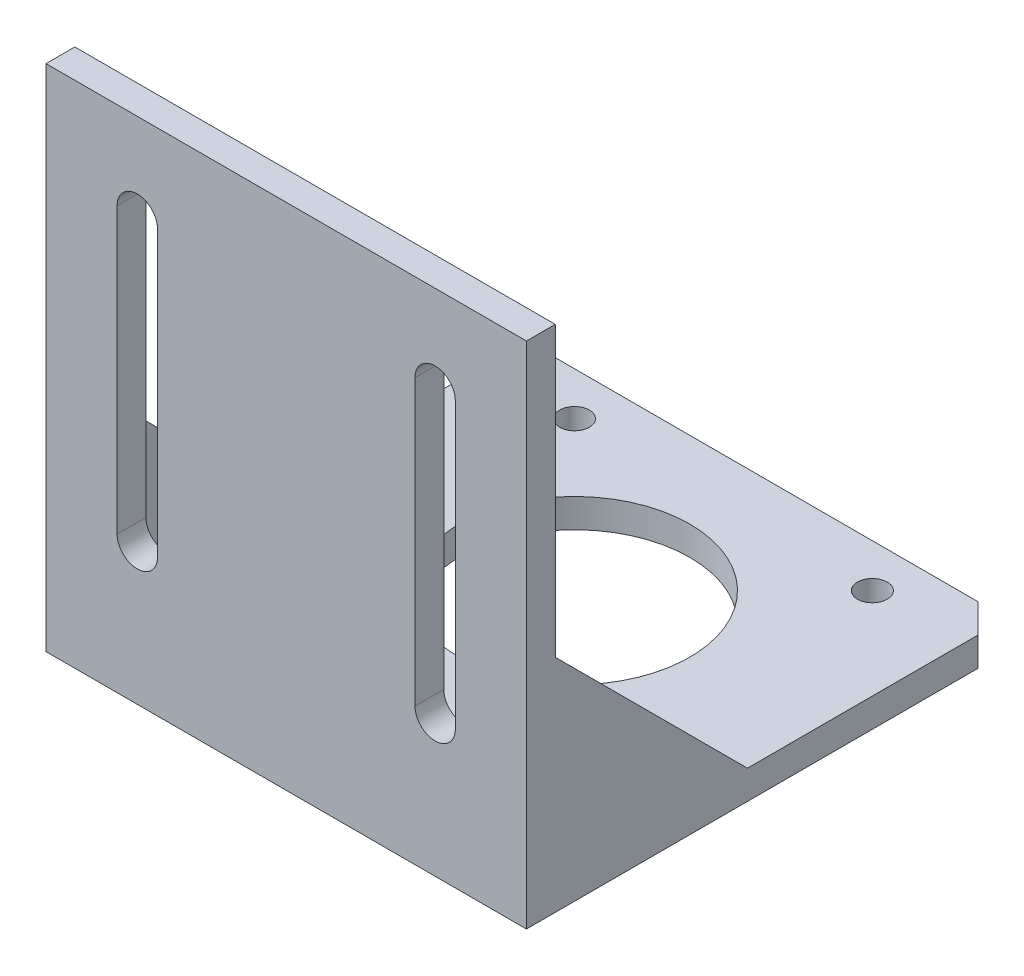
ISO-10303-21;
HEADER;
FILE_DESCRIPTION(('STEP AP214'),'2;1');
FILE_NAME('part.step','',(''),(''),'','','');
FILE_SCHEMA(('AUTOMOTIVE_DESIGN { 1 0 10303 214 1 1 1 1 }'));
ENDSEC;
DATA;
#1=APPLICATION_CONTEXT('core data for automotive mechanical design processes');
#2=APPLICATION_PROTOCOL_DEFINITION('international standard','automotive_design',2000,#1);
#3=PRODUCT_CONTEXT('',#1,'mechanical');
#4=PRODUCT('Part','Part','',(#3));
#5=PRODUCT_RELATED_PRODUCT_CATEGORY('part','',(#4));
#6=PRODUCT_DEFINITION_FORMATION('','',#4);
#7=PRODUCT_DEFINITION_CONTEXT('part definition',#1,'design');
#8=PRODUCT_DEFINITION('design','',#6,#7);
#9=PRODUCT_DEFINITION_SHAPE('','',#8);
#10=(LENGTH_UNIT() NAMED_UNIT(*) SI_UNIT(.MILLI.,.METRE.));
#11=(NAMED_UNIT(*) PLANE_ANGLE_UNIT() SI_UNIT($,.RADIAN.));
#12=(NAMED_UNIT(*) SI_UNIT($,.STERADIAN.) SOLID_ANGLE_UNIT());
#13=UNCERTAINTY_MEASURE_WITH_UNIT(LENGTH_MEASURE(1.E-05),#10,'distance_accuracy_value','');
#14=(GEOMETRIC_REPRESENTATION_CONTEXT(3) GLOBAL_UNCERTAINTY_ASSIGNED_CONTEXT((#13)) GLOBAL_UNIT_ASSIGNED_CONTEXT((#10,
#11,#12)) REPRESENTATION_CONTEXT('',''));
#15=CARTESIAN_POINT('',(0.,0.,0.));
#16=DIRECTION('',(0.,0.,1.));
#17=DIRECTION('',(1.,0.,0.));
#18=AXIS2_PLACEMENT_3D('',#15,#16,#17);
#19=CARTESIAN_POINT('',(0.,3.,0.));
#20=DIRECTION('',(0.,1.,0.));
#21=DIRECTION('',(0.,0.,1.));
#22=AXIS2_PLACEMENT_3D('',#19,#20,#21);
#23=PLANE('',#22);
#24=CARTESIAN_POINT('',(40.5,3.,-14.5));
#25=DIRECTION('',(0.,1.,0.));
#26=DIRECTION('',(0.,0.,1.));
#27=AXIS2_PLACEMENT_3D('',#24,#25,#26);
#28=CIRCLE('',#27,1.55);
#29=CARTESIAN_POINT('',(40.5,3.,-12.95));
#30=VERTEX_POINT('',#29);
#31=EDGE_CURVE('E301',#30,#30,#28,.T.);
#32=ORIENTED_EDGE('',*,*,#31,.F.);
#33=EDGE_LOOP('',(#32));
#34=FACE_BOUND('',#33,.T.);
#35=CARTESIAN_POINT('',(9.50000000000001,3.,-45.5));
#36=DIRECTION('',(0.,1.,0.));
#37=DIRECTION('',(0.,0.,1.));
#38=AXIS2_PLACEMENT_3D('',#35,#36,#37);
#39=CIRCLE('',#38,1.55);
#40=CARTESIAN_POINT('',(9.50000000000001,3.,-43.95));
#41=VERTEX_POINT('',#40);
#42=EDGE_CURVE('E313',#41,#41,#39,.T.);
#43=ORIENTED_EDGE('',*,*,#42,.F.);
#44=EDGE_LOOP('',(#43));
#45=FACE_BOUND('',#44,.T.);
#46=CARTESIAN_POINT('',(25.,3.,-30.));
#47=DIRECTION('',(0.,1.,0.));
#48=DIRECTION('',(0.,0.,1.));
#49=AXIS2_PLACEMENT_3D('',#46,#47,#48);
#50=CIRCLE('',#49,12.);
#51=CARTESIAN_POINT('',(25.,3.,-18.));
#52=VERTEX_POINT('',#51);
#53=EDGE_CURVE('E319',#52,#52,#50,.T.);
#54=ORIENTED_EDGE('',*,*,#53,.F.);
#55=EDGE_LOOP('',(#54));
#56=FACE_BOUND('',#55,.T.);
#57=CARTESIAN_POINT('',(40.5,3.,-45.5));
#58=DIRECTION('',(0.,1.,0.));
#59=DIRECTION('',(0.,0.,1.));
#60=AXIS2_PLACEMENT_3D('',#57,#58,#59);
#61=CIRCLE('',#60,1.54999999999999);
#62=CARTESIAN_POINT('',(40.5,3.,-43.95));
#63=VERTEX_POINT('',#62);
#64=EDGE_CURVE('E307',#63,#63,#61,.T.);
#65=ORIENTED_EDGE('',*,*,#64,.F.);
#66=EDGE_LOOP('',(#65));
#67=FACE_BOUND('',#66,.T.);
#68=CARTESIAN_POINT('',(9.50000000000001,3.,-14.5));
#69=DIRECTION('',(0.,1.,0.));
#70=DIRECTION('',(0.,0.,1.));
#71=AXIS2_PLACEMENT_3D('',#68,#69,#70);
#72=CIRCLE('',#71,1.55);
#73=CARTESIAN_POINT('',(9.50000000000001,3.,-12.95));
#74=VERTEX_POINT('',#73);
#75=EDGE_CURVE('E295',#74,#74,#72,.T.);
#76=ORIENTED_EDGE('',*,*,#75,.F.);
#77=EDGE_LOOP('',(#76));
#78=FACE_BOUND('',#77,.T.);
#79=DIRECTION('',(-1.,0.,0.));
#80=VECTOR('',#79,1.);
#81=CARTESIAN_POINT('',(0.,3.,-23.));
#82=LINE('',#81,#80);
#83=CARTESIAN_POINT('',(3.00000000000001,3.,-23.));
#84=VERTEX_POINT('',#83);
#85=CARTESIAN_POINT('',(0.,3.,-23.));
#86=VERTEX_POINT('',#85);
#87=EDGE_CURVE('E57',#84,#86,#82,.T.);
#88=ORIENTED_EDGE('',*,*,#87,.F.);
#89=DIRECTION('',(0.,0.,-1.));
#90=VECTOR('',#89,1.);
#91=CARTESIAN_POINT('',(3.00000000000001,3.,-3.));
#92=LINE('',#91,#90);
#93=CARTESIAN_POINT('',(3.00000000000001,3.,-3.));
#94=VERTEX_POINT('',#93);
#95=EDGE_CURVE('E216',#94,#84,#92,.T.);
#96=ORIENTED_EDGE('',*,*,#95,.F.);
#97=DIRECTION('',(-1.,0.,0.));
#98=VECTOR('',#97,1.);
#99=CARTESIAN_POINT('',(0.,3.,-3.));
#100=LINE('',#99,#98);
#101=CARTESIAN_POINT('',(47.,3.,-3.));
#102=VERTEX_POINT('',#101);
#103=EDGE_CURVE('E245',#102,#94,#100,.T.);
#104=ORIENTED_EDGE('',*,*,#103,.F.);
#105=DIRECTION('',(0.,0.,1.));
#106=VECTOR('',#105,1.);
#107=CARTESIAN_POINT('',(47.,3.,-3.));
#108=LINE('',#107,#106);
#109=CARTESIAN_POINT('',(47.,3.,-23.));
#110=VERTEX_POINT('',#109);
#111=EDGE_CURVE('E206',#110,#102,#108,.T.);
#112=ORIENTED_EDGE('',*,*,#111,.F.);
#113=DIRECTION('',(-1.,0.,0.));
#114=VECTOR('',#113,1.);
#115=CARTESIAN_POINT('',(50.,3.,-23.));
#116=LINE('',#115,#114);
#117=CARTESIAN_POINT('',(50.,3.,-23.));
#118=VERTEX_POINT('',#117);
#119=EDGE_CURVE('E210',#118,#110,#116,.T.);
#120=ORIENTED_EDGE('',*,*,#119,.F.);
#121=DIRECTION('',(0.,0.,-1.));
#122=VECTOR('',#121,1.);
#123=CARTESIAN_POINT('',(50.,3.,0.));
#124=LINE('',#123,#122);
#125=CARTESIAN_POINT('',(50.,3.,-46.9947961799572));
#126=VERTEX_POINT('',#125);
#127=EDGE_CURVE('E187',#118,#126,#124,.T.);
#128=ORIENTED_EDGE('',*,*,#127,.T.);
#129=DIRECTION('',(-0.707106781186547,0.,-0.707106781186548));
#130=VECTOR('',#129,1.);
#131=CARTESIAN_POINT('',(50.,3.,-46.9947961799572));
#132=LINE('',#131,#130);
#133=CARTESIAN_POINT('',(46.9947961799572,3.,-50.));
#134=VERTEX_POINT('',#133);
#135=EDGE_CURVE('E329',#126,#134,#132,.T.);
#136=ORIENTED_EDGE('',*,*,#135,.T.);
#137=DIRECTION('',(-1.,0.,0.));
#138=VECTOR('',#137,1.);
#139=CARTESIAN_POINT('',(46.9947961799572,3.,-50.));
#140=LINE('',#139,#138);
#141=CARTESIAN_POINT('',(3.00520382004284,3.,-50.));
#142=VERTEX_POINT('',#141);
#143=EDGE_CURVE('E331',#134,#142,#140,.T.);
#144=ORIENTED_EDGE('',*,*,#143,.T.);
#145=DIRECTION('',(-0.707106781186548,0.,0.707106781186547));
#146=VECTOR('',#145,1.);
#147=CARTESIAN_POINT('',(3.00520382004284,3.,-50.));
#148=LINE('',#147,#146);
#149=CARTESIAN_POINT('',(0.,3.,-46.9947961799572));
#150=VERTEX_POINT('',#149);
#151=EDGE_CURVE('E333',#142,#150,#148,.T.);
#152=ORIENTED_EDGE('',*,*,#151,.T.);
#153=DIRECTION('',(0.,0.,1.));
#154=VECTOR('',#153,1.);
#155=CARTESIAN_POINT('',(0.,3.,-46.9947961799572));
#156=LINE('',#155,#154);
#157=EDGE_CURVE('E325',#150,#86,#156,.T.);
#158=ORIENTED_EDGE('',*,*,#157,.T.);
#159=EDGE_LOOP('',(#88,#96,#104,#112,#120,#128,#136,#144,#152,#158));
#160=FACE_BOUND('',#159,.T.);
#161=ADVANCED_FACE('F41',(#34,#45,#56,#67,#78,#160),#23,.T.);
#162=CARTESIAN_POINT('',(0.,53.,-3.));
#163=DIRECTION('',(0.,0.,1.));
#164=DIRECTION('',(1.,0.,0.));
#165=AXIS2_PLACEMENT_3D('',#162,#163,#164);
#166=PLANE('',#165);
#167=DIRECTION('',(0.,1.,0.));
#168=VECTOR('',#167,1.);
#169=CARTESIAN_POINT('',(38.4,14.3,-3.));
#170=LINE('',#169,#168);
#171=CARTESIAN_POINT('',(38.4,14.3,-3.));
#172=VERTEX_POINT('',#171);
#173=CARTESIAN_POINT('',(38.4,43.9,-3.));
#174=VERTEX_POINT('',#173);
#175=EDGE_CURVE('E234',#172,#174,#170,.T.);
#176=ORIENTED_EDGE('',*,*,#175,.F.);
#177=CARTESIAN_POINT('',(40.5,14.3,-3.));
#178=DIRECTION('',(0.,0.,-1.));
#179=DIRECTION('',(-1.,0.,0.));
#180=AXIS2_PLACEMENT_3D('',#177,#178,#179);
#181=CIRCLE('',#180,2.1);
#182=CARTESIAN_POINT('',(42.6,14.3,-3.));
#183=VERTEX_POINT('',#182);
#184=EDGE_CURVE('E232',#183,#172,#181,.T.);
#185=ORIENTED_EDGE('',*,*,#184,.F.);
#186=DIRECTION('',(0.,-1.,0.));
#187=VECTOR('',#186,1.);
#188=CARTESIAN_POINT('',(42.6,14.3,-3.));
#189=LINE('',#188,#187);
#190=CARTESIAN_POINT('',(42.6,43.9,-3.));
#191=VERTEX_POINT('',#190);
#192=EDGE_CURVE('E222',#191,#183,#189,.T.);
#193=ORIENTED_EDGE('',*,*,#192,.F.);
#194=CARTESIAN_POINT('',(40.5,43.9,-3.));
#195=DIRECTION('',(0.,0.,-1.));
#196=DIRECTION('',(-1.,0.,0.));
#197=AXIS2_PLACEMENT_3D('',#194,#195,#196);
#198=CIRCLE('',#197,2.1);
#199=EDGE_CURVE('E238',#174,#191,#198,.T.);
#200=ORIENTED_EDGE('',*,*,#199,.F.);
#201=EDGE_LOOP('',(#176,#185,#193,#200));
#202=FACE_BOUND('',#201,.T.);
#203=DIRECTION('',(0.,1.,0.));
#204=VECTOR('',#203,1.);
#205=CARTESIAN_POINT('',(7.40000000000001,14.3,-3.));
#206=LINE('',#205,#204);
#207=CARTESIAN_POINT('',(7.40000000000001,14.3,-3.));
#208=VERTEX_POINT('',#207);
#209=CARTESIAN_POINT('',(7.40000000000001,43.9,-3.));
#210=VERTEX_POINT('',#209);
#211=EDGE_CURVE('E268',#208,#210,#206,.T.);
#212=ORIENTED_EDGE('',*,*,#211,.F.);
#213=CARTESIAN_POINT('',(9.50000000000001,14.3,-3.));
#214=DIRECTION('',(0.,0.,-1.));
#215=DIRECTION('',(-1.,0.,0.));
#216=AXIS2_PLACEMENT_3D('',#213,#214,#215);
#217=CIRCLE('',#216,2.1);
#218=CARTESIAN_POINT('',(11.6,14.3,-3.));
#219=VERTEX_POINT('',#218);
#220=EDGE_CURVE('E235',#219,#208,#217,.T.);
#221=ORIENTED_EDGE('',*,*,#220,.F.);
#222=DIRECTION('',(0.,-1.,0.));
#223=VECTOR('',#222,1.);
#224=CARTESIAN_POINT('',(11.6,14.3,-3.));
#225=LINE('',#224,#223);
#226=CARTESIAN_POINT('',(11.6,43.9,-3.));
#227=VERTEX_POINT('',#226);
#228=EDGE_CURVE('E261',#227,#219,#225,.T.);
#229=ORIENTED_EDGE('',*,*,#228,.F.);
#230=CARTESIAN_POINT('',(9.50000000000001,43.9,-3.));
#231=DIRECTION('',(0.,0.,-1.));
#232=DIRECTION('',(-1.,0.,0.));
#233=AXIS2_PLACEMENT_3D('',#230,#231,#232);
#234=CIRCLE('',#233,2.1);
#235=EDGE_CURVE('E264',#210,#227,#234,.T.);
#236=ORIENTED_EDGE('',*,*,#235,.F.);
#237=EDGE_LOOP('',(#212,#221,#229,#236));
#238=FACE_BOUND('',#237,.T.);
#239=DIRECTION('',(0.,-1.,0.));
#240=VECTOR('',#239,1.);
#241=CARTESIAN_POINT('',(3.00000000000001,23.,-3.));
#242=LINE('',#241,#240);
#243=CARTESIAN_POINT('',(3.00000000000001,23.,-3.));
#244=VERTEX_POINT('',#243);
#245=EDGE_CURVE('E374',#244,#94,#242,.T.);
#246=ORIENTED_EDGE('',*,*,#245,.F.);
#247=DIRECTION('',(1.,0.,0.));
#248=VECTOR('',#247,1.);
#249=CARTESIAN_POINT('',(0.,23.,-3.));
#250=LINE('',#249,#248);
#251=CARTESIAN_POINT('',(0.,23.,-3.));
#252=VERTEX_POINT('',#251);
#253=EDGE_CURVE('E214',#252,#244,#250,.T.);
#254=ORIENTED_EDGE('',*,*,#253,.F.);
#255=DIRECTION('',(0.,-1.,0.));
#256=VECTOR('',#255,1.);
#257=CARTESIAN_POINT('',(0.,53.,-3.));
#258=LINE('',#257,#256);
#259=CARTESIAN_POINT('',(0.,53.,-3.));
#260=VERTEX_POINT('',#259);
#261=EDGE_CURVE('E201',#260,#252,#258,.T.);
#262=ORIENTED_EDGE('',*,*,#261,.F.);
#263=DIRECTION('',(-1.,0.,0.));
#264=VECTOR('',#263,1.);
#265=CARTESIAN_POINT('',(0.,53.,-3.));
#266=LINE('',#265,#264);
#267=CARTESIAN_POINT('',(50.,53.,-3.));
#268=VERTEX_POINT('',#267);
#269=EDGE_CURVE('E199',#268,#260,#266,.T.);
#270=ORIENTED_EDGE('',*,*,#269,.F.);
#271=DIRECTION('',(0.,-1.,0.));
#272=VECTOR('',#271,1.);
#273=CARTESIAN_POINT('',(50.,53.,-3.));
#274=LINE('',#273,#272);
#275=CARTESIAN_POINT('',(50.,23.,-3.));
#276=VERTEX_POINT('',#275);
#277=EDGE_CURVE('E184',#268,#276,#274,.T.);
#278=ORIENTED_EDGE('',*,*,#277,.T.);
#279=DIRECTION('',(1.,0.,0.));
#280=VECTOR('',#279,1.);
#281=CARTESIAN_POINT('',(50.,23.,-3.));
#282=LINE('',#281,#280);
#283=CARTESIAN_POINT('',(47.,23.,-3.));
#284=VERTEX_POINT('',#283);
#285=EDGE_CURVE('E197',#284,#276,#282,.T.);
#286=ORIENTED_EDGE('',*,*,#285,.F.);
#287=DIRECTION('',(0.,-1.,0.));
#288=VECTOR('',#287,1.);
#289=CARTESIAN_POINT('',(47.,23.,-3.));
#290=LINE('',#289,#288);
#291=EDGE_CURVE('E205',#284,#102,#290,.T.);
#292=ORIENTED_EDGE('',*,*,#291,.T.);
#293=ORIENTED_EDGE('',*,*,#103,.T.);
#294=EDGE_LOOP('',(#246,#254,#262,#270,#278,#286,#292,#293));
#295=FACE_BOUND('',#294,.T.);
#296=ADVANCED_FACE('F195',(#202,#238,#295),#166,.F.);
#297=CARTESIAN_POINT('',(0.,0.,0.));
#298=DIRECTION('',(0.,1.,0.));
#299=DIRECTION('',(0.,0.,1.));
#300=AXIS2_PLACEMENT_3D('',#297,#298,#299);
#301=PLANE('',#300);
#302=DIRECTION('',(0.,0.,1.));
#303=VECTOR('',#302,1.);
#304=CARTESIAN_POINT('',(0.,0.,-46.9947961799572));
#305=LINE('',#304,#303);
#306=CARTESIAN_POINT('',(0.,0.,-46.9947961799572));
#307=VERTEX_POINT('',#306);
#308=CARTESIAN_POINT('',(0.,0.,0.));
#309=VERTEX_POINT('',#308);
#310=EDGE_CURVE('E322',#307,#309,#305,.T.);
#311=ORIENTED_EDGE('',*,*,#310,.F.);
#312=DIRECTION('',(-0.707106781186548,0.,0.707106781186547));
#313=VECTOR('',#312,1.);
#314=CARTESIAN_POINT('',(3.00520382004284,0.,-50.));
#315=LINE('',#314,#313);
#316=CARTESIAN_POINT('',(3.00520382004284,0.,-50.));
#317=VERTEX_POINT('',#316);
#318=EDGE_CURVE('E327',#317,#307,#315,.T.);
#319=ORIENTED_EDGE('',*,*,#318,.F.);
#320=DIRECTION('',(-1.,0.,0.));
#321=VECTOR('',#320,1.);
#322=CARTESIAN_POINT('',(46.9947961799572,0.,-50.));
#323=LINE('',#322,#321);
#324=CARTESIAN_POINT('',(46.9947961799572,0.,-50.));
#325=VERTEX_POINT('',#324);
#326=EDGE_CURVE('E344',#325,#317,#323,.T.);
#327=ORIENTED_EDGE('',*,*,#326,.F.);
#328=DIRECTION('',(-0.707106781186547,0.,-0.707106781186548));
#329=VECTOR('',#328,1.);
#330=CARTESIAN_POINT('',(50.,0.,-46.9947961799572));
#331=LINE('',#330,#329);
#332=CARTESIAN_POINT('',(50.,0.,-46.9947961799572));
#333=VERTEX_POINT('',#332);
#334=EDGE_CURVE('E342',#333,#325,#331,.T.);
#335=ORIENTED_EDGE('',*,*,#334,.F.);
#336=DIRECTION('',(0.,0.,-1.));
#337=VECTOR('',#336,1.);
#338=CARTESIAN_POINT('',(50.,0.,0.));
#339=LINE('',#338,#337);
#340=CARTESIAN_POINT('',(50.,0.,0.));
#341=VERTEX_POINT('',#340);
#342=EDGE_CURVE('E340',#341,#333,#339,.T.);
#343=ORIENTED_EDGE('',*,*,#342,.F.);
#344=DIRECTION('',(1.,0.,0.));
#345=VECTOR('',#344,1.);
#346=CARTESIAN_POINT('',(0.,0.,0.));
#347=LINE('',#346,#345);
#348=EDGE_CURVE('E338',#309,#341,#347,.T.);
#349=ORIENTED_EDGE('',*,*,#348,.F.);
#350=EDGE_LOOP('',(#311,#319,#327,#335,#343,#349));
#351=FACE_BOUND('',#350,.T.);
#352=CARTESIAN_POINT('',(25.,0.,-30.));
#353=DIRECTION('',(0.,1.,0.));
#354=DIRECTION('',(0.,0.,1.));
#355=AXIS2_PLACEMENT_3D('',#352,#353,#354);
#356=CIRCLE('',#355,12.);
#357=CARTESIAN_POINT('',(25.,0.,-18.));
#358=VERTEX_POINT('',#357);
#359=EDGE_CURVE('E316',#358,#358,#356,.T.);
#360=ORIENTED_EDGE('',*,*,#359,.T.);
#361=EDGE_LOOP('',(#360));
#362=FACE_BOUND('',#361,.T.);
#363=CARTESIAN_POINT('',(9.50000000000001,0.,-45.5));
#364=DIRECTION('',(0.,1.,0.));
#365=DIRECTION('',(0.,0.,1.));
#366=AXIS2_PLACEMENT_3D('',#363,#364,#365);
#367=CIRCLE('',#366,1.55);
#368=CARTESIAN_POINT('',(9.50000000000001,0.,-43.95));
#369=VERTEX_POINT('',#368);
#370=EDGE_CURVE('E310',#369,#369,#367,.T.);
#371=ORIENTED_EDGE('',*,*,#370,.T.);
#372=EDGE_LOOP('',(#371));
#373=FACE_BOUND('',#372,.T.);
#374=CARTESIAN_POINT('',(40.5,0.,-45.5));
#375=DIRECTION('',(0.,1.,0.));
#376=DIRECTION('',(0.,0.,1.));
#377=AXIS2_PLACEMENT_3D('',#374,#375,#376);
#378=CIRCLE('',#377,1.54999999999999);
#379=CARTESIAN_POINT('',(40.5,0.,-43.95));
#380=VERTEX_POINT('',#379);
#381=EDGE_CURVE('E304',#380,#380,#378,.T.);
#382=ORIENTED_EDGE('',*,*,#381,.T.);
#383=EDGE_LOOP('',(#382));
#384=FACE_BOUND('',#383,.T.);
#385=CARTESIAN_POINT('',(40.5,0.,-14.5));
#386=DIRECTION('',(0.,1.,0.));
#387=DIRECTION('',(0.,0.,1.));
#388=AXIS2_PLACEMENT_3D('',#385,#386,#387);
#389=CIRCLE('',#388,1.55);
#390=CARTESIAN_POINT('',(40.5,0.,-12.95));
#391=VERTEX_POINT('',#390);
#392=EDGE_CURVE('E298',#391,#391,#389,.T.);
#393=ORIENTED_EDGE('',*,*,#392,.T.);
#394=EDGE_LOOP('',(#393));
#395=FACE_BOUND('',#394,.T.);
#396=CARTESIAN_POINT('',(9.50000000000001,0.,-14.5));
#397=DIRECTION('',(0.,1.,0.));
#398=DIRECTION('',(0.,0.,1.));
#399=AXIS2_PLACEMENT_3D('',#396,#397,#398);
#400=CIRCLE('',#399,1.55);
#401=CARTESIAN_POINT('',(9.50000000000001,0.,-12.95));
#402=VERTEX_POINT('',#401);
#403=EDGE_CURVE('E200',#402,#402,#400,.T.);
#404=ORIENTED_EDGE('',*,*,#403,.T.);
#405=EDGE_LOOP('',(#404));
#406=FACE_BOUND('',#405,.T.);
#407=ADVANCED_FACE('F400',(#351,#362,#373,#384,#395,#406),#301,.F.);
#408=CARTESIAN_POINT('',(0.,3.,-46.9947961799572));
#409=DIRECTION('',(1.,0.,0.));
#410=DIRECTION('',(0.,0.,-1.));
#411=AXIS2_PLACEMENT_3D('',#408,#409,#410);
#412=PLANE('',#411);
#413=ORIENTED_EDGE('',*,*,#261,.T.);
#414=DIRECTION('',(0.,0.707106781186549,0.707106781186546));
#415=VECTOR('',#414,1.);
#416=CARTESIAN_POINT('',(0.,23.,-3.00000000000001));
#417=LINE('',#416,#415);
#418=EDGE_CURVE('E50',#252,#86,#417,.F.);
#419=ORIENTED_EDGE('',*,*,#418,.T.);
#420=ORIENTED_EDGE('',*,*,#157,.F.);
#421=DIRECTION('',(0.,-1.,0.));
#422=VECTOR('',#421,1.);
#423=CARTESIAN_POINT('',(0.,3.,-46.9947961799572));
#424=LINE('',#423,#422);
#425=EDGE_CURVE('E335',#150,#307,#424,.T.);
#426=ORIENTED_EDGE('',*,*,#425,.T.);
#427=ORIENTED_EDGE('',*,*,#310,.T.);
#428=DIRECTION('',(0.,-1.,0.));
#429=VECTOR('',#428,1.);
#430=CARTESIAN_POINT('',(0.,3.,0.));
#431=LINE('',#430,#429);
#432=CARTESIAN_POINT('',(0.,53.,0.));
#433=VERTEX_POINT('',#432);
#434=EDGE_CURVE('E361',#433,#309,#431,.T.);
#435=ORIENTED_EDGE('',*,*,#434,.F.);
#436=DIRECTION('',(0.,0.,1.));
#437=VECTOR('',#436,1.);
#438=CARTESIAN_POINT('',(0.,53.,0.));
#439=LINE('',#438,#437);
#440=EDGE_CURVE('E282',#260,#433,#439,.T.);
#441=ORIENTED_EDGE('',*,*,#440,.F.);
#442=EDGE_LOOP('',(#413,#419,#420,#426,#427,#435,#441));
#443=FACE_BOUND('',#442,.T.);
#444=ADVANCED_FACE('F366',(#443),#412,.F.);
#445=CARTESIAN_POINT('',(0.,3.,0.));
#446=DIRECTION('',(0.,0.,-1.));
#447=DIRECTION('',(-1.,0.,0.));
#448=AXIS2_PLACEMENT_3D('',#445,#446,#447);
#449=PLANE('',#448);
#450=DIRECTION('',(0.,-1.,0.));
#451=VECTOR('',#450,1.);
#452=CARTESIAN_POINT('',(42.6,14.3,0.));
#453=LINE('',#452,#451);
#454=CARTESIAN_POINT('',(42.6,43.9,0.));
#455=VERTEX_POINT('',#454);
#456=CARTESIAN_POINT('',(42.6,14.3,0.));
#457=VERTEX_POINT('',#456);
#458=EDGE_CURVE('E228',#455,#457,#453,.T.);
#459=ORIENTED_EDGE('',*,*,#458,.T.);
#460=CARTESIAN_POINT('',(40.5,14.3,0.));
#461=DIRECTION('',(0.,0.,-1.));
#462=DIRECTION('',(-1.,0.,0.));
#463=AXIS2_PLACEMENT_3D('',#460,#461,#462);
#464=CIRCLE('',#463,2.1);
#465=CARTESIAN_POINT('',(38.4,14.3,0.));
#466=VERTEX_POINT('',#465);
#467=EDGE_CURVE('E218',#457,#466,#464,.T.);
#468=ORIENTED_EDGE('',*,*,#467,.T.);
#469=DIRECTION('',(0.,1.,0.));
#470=VECTOR('',#469,1.);
#471=CARTESIAN_POINT('',(38.4,14.3,0.));
#472=LINE('',#471,#470);
#473=CARTESIAN_POINT('',(38.4,43.9,0.));
#474=VERTEX_POINT('',#473);
#475=EDGE_CURVE('E221',#466,#474,#472,.T.);
#476=ORIENTED_EDGE('',*,*,#475,.T.);
#477=CARTESIAN_POINT('',(40.5,43.9,0.));
#478=DIRECTION('',(0.,0.,-1.));
#479=DIRECTION('',(-1.,0.,0.));
#480=AXIS2_PLACEMENT_3D('',#477,#478,#479);
#481=CIRCLE('',#480,2.1);
#482=EDGE_CURVE('E225',#474,#455,#481,.T.);
#483=ORIENTED_EDGE('',*,*,#482,.T.);
#484=EDGE_LOOP('',(#459,#468,#476,#483));
#485=FACE_BOUND('',#484,.T.);
#486=DIRECTION('',(0.,-1.,0.));
#487=VECTOR('',#486,1.);
#488=CARTESIAN_POINT('',(11.6,14.3,0.));
#489=LINE('',#488,#487);
#490=CARTESIAN_POINT('',(11.6,43.9,0.));
#491=VERTEX_POINT('',#490);
#492=CARTESIAN_POINT('',(11.6,14.3,0.));
#493=VERTEX_POINT('',#492);
#494=EDGE_CURVE('E255',#491,#493,#489,.T.);
#495=ORIENTED_EDGE('',*,*,#494,.T.);
#496=CARTESIAN_POINT('',(9.50000000000001,14.3,0.));
#497=DIRECTION('',(0.,0.,-1.));
#498=DIRECTION('',(-1.,0.,0.));
#499=AXIS2_PLACEMENT_3D('',#496,#497,#498);
#500=CIRCLE('',#499,2.1);
#501=CARTESIAN_POINT('',(7.40000000000001,14.3,0.));
#502=VERTEX_POINT('',#501);
#503=EDGE_CURVE('E265',#493,#502,#500,.T.);
#504=ORIENTED_EDGE('',*,*,#503,.T.);
#505=DIRECTION('',(0.,1.,0.));
#506=VECTOR('',#505,1.);
#507=CARTESIAN_POINT('',(7.40000000000001,14.3,0.));
#508=LINE('',#507,#506);
#509=CARTESIAN_POINT('',(7.40000000000001,43.9,0.));
#510=VERTEX_POINT('',#509);
#511=EDGE_CURVE('E277',#502,#510,#508,.T.);
#512=ORIENTED_EDGE('',*,*,#511,.T.);
#513=CARTESIAN_POINT('',(9.50000000000001,43.9,0.));
#514=DIRECTION('',(0.,0.,-1.));
#515=DIRECTION('',(-1.,0.,0.));
#516=AXIS2_PLACEMENT_3D('',#513,#514,#515);
#517=CIRCLE('',#516,2.1);
#518=EDGE_CURVE('E274',#510,#491,#517,.T.);
#519=ORIENTED_EDGE('',*,*,#518,.T.);
#520=EDGE_LOOP('',(#495,#504,#512,#519));
#521=FACE_BOUND('',#520,.T.);
#522=ORIENTED_EDGE('',*,*,#348,.T.);
#523=DIRECTION('',(0.,-1.,0.));
#524=VECTOR('',#523,1.);
#525=CARTESIAN_POINT('',(50.,3.,0.));
#526=LINE('',#525,#524);
#527=CARTESIAN_POINT('',(50.,53.,0.));
#528=VERTEX_POINT('',#527);
#529=EDGE_CURVE('E358',#528,#341,#526,.T.);
#530=ORIENTED_EDGE('',*,*,#529,.F.);
#531=DIRECTION('',(1.,0.,0.));
#532=VECTOR('',#531,1.);
#533=CARTESIAN_POINT('',(0.,53.,0.));
#534=LINE('',#533,#532);
#535=EDGE_CURVE('E285',#433,#528,#534,.T.);
#536=ORIENTED_EDGE('',*,*,#535,.F.);
#537=ORIENTED_EDGE('',*,*,#434,.T.);
#538=EDGE_LOOP('',(#522,#530,#536,#537));
#539=FACE_BOUND('',#538,.T.);
#540=ADVANCED_FACE('F425',(#485,#521,#539),#449,.F.);
#541=CARTESIAN_POINT('',(50.,3.,0.));
#542=DIRECTION('',(-1.,0.,0.));
#543=DIRECTION('',(0.,0.,1.));
#544=AXIS2_PLACEMENT_3D('',#541,#542,#543);
#545=PLANE('',#544);
#546=ORIENTED_EDGE('',*,*,#127,.F.);
#547=DIRECTION('',(0.,0.707106781186549,0.707106781186546));
#548=VECTOR('',#547,1.);
#549=CARTESIAN_POINT('',(50.,23.,-3.00000000000001));
#550=LINE('',#549,#548);
#551=EDGE_CURVE('E180',#118,#276,#550,.T.);
#552=ORIENTED_EDGE('',*,*,#551,.T.);
#553=ORIENTED_EDGE('',*,*,#277,.F.);
#554=DIRECTION('',(0.,0.,-1.));
#555=VECTOR('',#554,1.);
#556=CARTESIAN_POINT('',(50.,53.,0.));
#557=LINE('',#556,#555);
#558=EDGE_CURVE('E288',#528,#268,#557,.T.);
#559=ORIENTED_EDGE('',*,*,#558,.F.);
#560=ORIENTED_EDGE('',*,*,#529,.T.);
#561=ORIENTED_EDGE('',*,*,#342,.T.);
#562=DIRECTION('',(0.,-1.,0.));
#563=VECTOR('',#562,1.);
#564=CARTESIAN_POINT('',(50.,3.,-46.9947961799572));
#565=LINE('',#564,#563);
#566=EDGE_CURVE('E355',#126,#333,#565,.T.);
#567=ORIENTED_EDGE('',*,*,#566,.F.);
#568=EDGE_LOOP('',(#546,#552,#553,#559,#560,#561,#567));
#569=FACE_BOUND('',#568,.T.);
#570=ADVANCED_FACE('F182',(#569),#545,.F.);
#571=CARTESIAN_POINT('',(50.,3.,-46.9947961799572));
#572=DIRECTION('',(-0.707106781186548,0.,0.707106781186547));
#573=DIRECTION('',(0.707106781186547,0.,0.707106781186548));
#574=AXIS2_PLACEMENT_3D('',#571,#572,#573);
#575=PLANE('',#574);
#576=ORIENTED_EDGE('',*,*,#334,.T.);
#577=DIRECTION('',(0.,-1.,0.));
#578=VECTOR('',#577,1.);
#579=CARTESIAN_POINT('',(46.9947961799572,3.,-50.));
#580=LINE('',#579,#578);
#581=EDGE_CURVE('E352',#134,#325,#580,.T.);
#582=ORIENTED_EDGE('',*,*,#581,.F.);
#583=ORIENTED_EDGE('',*,*,#135,.F.);
#584=ORIENTED_EDGE('',*,*,#566,.T.);
#585=EDGE_LOOP('',(#576,#582,#583,#584));
#586=FACE_BOUND('',#585,.T.);
#587=ADVANCED_FACE('F419',(#586),#575,.F.);
#588=CARTESIAN_POINT('',(46.9947961799572,3.,-50.));
#589=DIRECTION('',(0.,0.,1.));
#590=DIRECTION('',(1.,0.,0.));
#591=AXIS2_PLACEMENT_3D('',#588,#589,#590);
#592=PLANE('',#591);
#593=ORIENTED_EDGE('',*,*,#326,.T.);
#594=DIRECTION('',(0.,-1.,0.));
#595=VECTOR('',#594,1.);
#596=CARTESIAN_POINT('',(3.00520382004284,3.,-50.));
#597=LINE('',#596,#595);
#598=EDGE_CURVE('E349',#142,#317,#597,.T.);
#599=ORIENTED_EDGE('',*,*,#598,.F.);
#600=ORIENTED_EDGE('',*,*,#143,.F.);
#601=ORIENTED_EDGE('',*,*,#581,.T.);
#602=EDGE_LOOP('',(#593,#599,#600,#601));
#603=FACE_BOUND('',#602,.T.);
#604=ADVANCED_FACE('F415',(#603),#592,.F.);
#605=CARTESIAN_POINT('',(3.00520382004284,3.,-50.));
#606=DIRECTION('',(0.707106781186547,0.,0.707106781186548));
#607=DIRECTION('',(0.707106781186548,0.,-0.707106781186547));
#608=AXIS2_PLACEMENT_3D('',#605,#606,#607);
#609=PLANE('',#608);
#610=ORIENTED_EDGE('',*,*,#318,.T.);
#611=ORIENTED_EDGE('',*,*,#425,.F.);
#612=ORIENTED_EDGE('',*,*,#151,.F.);
#613=ORIENTED_EDGE('',*,*,#598,.T.);
#614=EDGE_LOOP('',(#610,#611,#612,#613));
#615=FACE_BOUND('',#614,.T.);
#616=ADVANCED_FACE('F412',(#615),#609,.F.);
#617=CARTESIAN_POINT('',(25.,3.,-30.));
#618=DIRECTION('',(0.,-1.,0.));
#619=DIRECTION('',(0.,0.,-1.));
#620=AXIS2_PLACEMENT_3D('',#617,#618,#619);
#621=CYLINDRICAL_SURFACE('',#620,12.);
#622=ORIENTED_EDGE('',*,*,#53,.T.);
#623=EDGE_LOOP('',(#622));
#624=FACE_BOUND('',#623,.T.);
#625=ORIENTED_EDGE('',*,*,#359,.F.);
#626=EDGE_LOOP('',(#625));
#627=FACE_BOUND('',#626,.T.);
#628=ADVANCED_FACE('F407',(#624,#627),#621,.F.);
#629=CARTESIAN_POINT('',(9.50000000000001,3.,-45.5));
#630=DIRECTION('',(0.,-1.,0.));
#631=DIRECTION('',(0.,0.,-1.));
#632=AXIS2_PLACEMENT_3D('',#629,#630,#631);
#633=CYLINDRICAL_SURFACE('',#632,1.55);
#634=ORIENTED_EDGE('',*,*,#42,.T.);
#635=EDGE_LOOP('',(#634));
#636=FACE_BOUND('',#635,.T.);
#637=ORIENTED_EDGE('',*,*,#370,.F.);
#638=EDGE_LOOP('',(#637));
#639=FACE_BOUND('',#638,.T.);
#640=ADVANCED_FACE('F614',(#636,#639),#633,.F.);
#641=CARTESIAN_POINT('',(40.5,3.,-45.5));
#642=DIRECTION('',(0.,-1.,0.));
#643=DIRECTION('',(0.,0.,-1.));
#644=AXIS2_PLACEMENT_3D('',#641,#642,#643);
#645=CYLINDRICAL_SURFACE('',#644,1.54999999999999);
#646=ORIENTED_EDGE('',*,*,#64,.T.);
#647=EDGE_LOOP('',(#646));
#648=FACE_BOUND('',#647,.T.);
#649=ORIENTED_EDGE('',*,*,#381,.F.);
#650=EDGE_LOOP('',(#649));
#651=FACE_BOUND('',#650,.T.);
#652=ADVANCED_FACE('F623',(#648,#651),#645,.F.);
#653=CARTESIAN_POINT('',(40.5,3.,-14.5));
#654=DIRECTION('',(0.,-1.,0.));
#655=DIRECTION('',(0.,0.,-1.));
#656=AXIS2_PLACEMENT_3D('',#653,#654,#655);
#657=CYLINDRICAL_SURFACE('',#656,1.55);
#658=ORIENTED_EDGE('',*,*,#31,.T.);
#659=EDGE_LOOP('',(#658));
#660=FACE_BOUND('',#659,.T.);
#661=ORIENTED_EDGE('',*,*,#392,.F.);
#662=EDGE_LOOP('',(#661));
#663=FACE_BOUND('',#662,.T.);
#664=ADVANCED_FACE('F632',(#660,#663),#657,.F.);
#665=CARTESIAN_POINT('',(9.50000000000001,3.,-14.5));
#666=DIRECTION('',(0.,-1.,0.));
#667=DIRECTION('',(0.,0.,-1.));
#668=AXIS2_PLACEMENT_3D('',#665,#666,#667);
#669=CYLINDRICAL_SURFACE('',#668,1.55);
#670=ORIENTED_EDGE('',*,*,#75,.T.);
#671=EDGE_LOOP('',(#670));
#672=FACE_BOUND('',#671,.T.);
#673=ORIENTED_EDGE('',*,*,#403,.F.);
#674=EDGE_LOOP('',(#673));
#675=FACE_BOUND('',#674,.T.);
#676=ADVANCED_FACE('F565',(#672,#675),#669,.F.);
#677=CARTESIAN_POINT('',(0.,53.,0.));
#678=DIRECTION('',(0.,-1.,0.));
#679=DIRECTION('',(0.,0.,-1.));
#680=AXIS2_PLACEMENT_3D('',#677,#678,#679);
#681=PLANE('',#680);
#682=ORIENTED_EDGE('',*,*,#440,.T.);
#683=ORIENTED_EDGE('',*,*,#535,.T.);
#684=ORIENTED_EDGE('',*,*,#558,.T.);
#685=ORIENTED_EDGE('',*,*,#269,.T.);
#686=EDGE_LOOP('',(#682,#683,#684,#685));
#687=FACE_BOUND('',#686,.T.);
#688=ADVANCED_FACE('F556',(#687),#681,.F.);
#689=CARTESIAN_POINT('',(9.50000000000001,14.3,0.));
#690=DIRECTION('',(0.,0.,-1.));
#691=DIRECTION('',(-1.,0.,0.));
#692=AXIS2_PLACEMENT_3D('',#689,#690,#691);
#693=CYLINDRICAL_SURFACE('',#692,2.1);
#694=ORIENTED_EDGE('',*,*,#220,.T.);
#695=DIRECTION('',(0.,0.,-1.));
#696=VECTOR('',#695,1.);
#697=CARTESIAN_POINT('',(7.40000000000001,14.3,0.));
#698=LINE('',#697,#696);
#699=EDGE_CURVE('E252',#502,#208,#698,.T.);
#700=ORIENTED_EDGE('',*,*,#699,.F.);
#701=ORIENTED_EDGE('',*,*,#503,.F.);
#702=DIRECTION('',(0.,0.,-1.));
#703=VECTOR('',#702,1.);
#704=CARTESIAN_POINT('',(11.6,14.3,0.));
#705=LINE('',#704,#703);
#706=EDGE_CURVE('E208',#493,#219,#705,.T.);
#707=ORIENTED_EDGE('',*,*,#706,.T.);
#708=EDGE_LOOP('',(#694,#700,#701,#707));
#709=FACE_BOUND('',#708,.T.);
#710=ADVANCED_FACE('F547',(#709),#693,.F.);
#711=CARTESIAN_POINT('',(11.6,14.3,0.));
#712=DIRECTION('',(1.,0.,0.));
#713=DIRECTION('',(0.,0.,-1.));
#714=AXIS2_PLACEMENT_3D('',#711,#712,#713);
#715=PLANE('',#714);
#716=ORIENTED_EDGE('',*,*,#228,.T.);
#717=ORIENTED_EDGE('',*,*,#706,.F.);
#718=ORIENTED_EDGE('',*,*,#494,.F.);
#719=DIRECTION('',(0.,0.,-1.));
#720=VECTOR('',#719,1.);
#721=CARTESIAN_POINT('',(11.6,43.9,0.));
#722=LINE('',#721,#720);
#723=EDGE_CURVE('E258',#491,#227,#722,.T.);
#724=ORIENTED_EDGE('',*,*,#723,.T.);
#725=EDGE_LOOP('',(#716,#717,#718,#724));
#726=FACE_BOUND('',#725,.T.);
#727=ADVANCED_FACE('F537',(#726),#715,.F.);
#728=CARTESIAN_POINT('',(9.50000000000001,43.9,0.));
#729=DIRECTION('',(0.,0.,-1.));
#730=DIRECTION('',(-1.,0.,0.));
#731=AXIS2_PLACEMENT_3D('',#728,#729,#730);
#732=CYLINDRICAL_SURFACE('',#731,2.1);
#733=ORIENTED_EDGE('',*,*,#235,.T.);
#734=ORIENTED_EDGE('',*,*,#723,.F.);
#735=ORIENTED_EDGE('',*,*,#518,.F.);
#736=DIRECTION('',(0.,0.,-1.));
#737=VECTOR('',#736,1.);
#738=CARTESIAN_POINT('',(7.40000000000001,43.9,0.));
#739=LINE('',#738,#737);
#740=EDGE_CURVE('E256',#510,#210,#739,.T.);
#741=ORIENTED_EDGE('',*,*,#740,.T.);
#742=EDGE_LOOP('',(#733,#734,#735,#741));
#743=FACE_BOUND('',#742,.T.);
#744=ADVANCED_FACE('F527',(#743),#732,.F.);
#745=CARTESIAN_POINT('',(7.40000000000001,14.3,0.));
#746=DIRECTION('',(-1.,0.,0.));
#747=DIRECTION('',(0.,0.,1.));
#748=AXIS2_PLACEMENT_3D('',#745,#746,#747);
#749=PLANE('',#748);
#750=ORIENTED_EDGE('',*,*,#211,.T.);
#751=ORIENTED_EDGE('',*,*,#740,.F.);
#752=ORIENTED_EDGE('',*,*,#511,.F.);
#753=ORIENTED_EDGE('',*,*,#699,.T.);
#754=EDGE_LOOP('',(#750,#751,#752,#753));
#755=FACE_BOUND('',#754,.T.);
#756=ADVANCED_FACE('F517',(#755),#749,.F.);
#757=CARTESIAN_POINT('',(40.5,14.3,0.));
#758=DIRECTION('',(0.,0.,-1.));
#759=DIRECTION('',(-1.,0.,0.));
#760=AXIS2_PLACEMENT_3D('',#757,#758,#759);
#761=CYLINDRICAL_SURFACE('',#760,2.1);
#762=ORIENTED_EDGE('',*,*,#184,.T.);
#763=DIRECTION('',(0.,0.,-1.));
#764=VECTOR('',#763,1.);
#765=CARTESIAN_POINT('',(38.4,14.3,0.));
#766=LINE('',#765,#764);
#767=EDGE_CURVE('E231',#466,#172,#766,.T.);
#768=ORIENTED_EDGE('',*,*,#767,.F.);
#769=ORIENTED_EDGE('',*,*,#467,.F.);
#770=DIRECTION('',(0.,0.,-1.));
#771=VECTOR('',#770,1.);
#772=CARTESIAN_POINT('',(42.6,14.3,0.));
#773=LINE('',#772,#771);
#774=EDGE_CURVE('E243',#457,#183,#773,.T.);
#775=ORIENTED_EDGE('',*,*,#774,.T.);
#776=EDGE_LOOP('',(#762,#768,#769,#775));
#777=FACE_BOUND('',#776,.T.);
#778=ADVANCED_FACE('F508',(#777),#761,.F.);
#779=CARTESIAN_POINT('',(42.6,14.3,0.));
#780=DIRECTION('',(1.,0.,0.));
#781=DIRECTION('',(0.,0.,-1.));
#782=AXIS2_PLACEMENT_3D('',#779,#780,#781);
#783=PLANE('',#782);
#784=ORIENTED_EDGE('',*,*,#192,.T.);
#785=ORIENTED_EDGE('',*,*,#774,.F.);
#786=ORIENTED_EDGE('',*,*,#458,.F.);
#787=DIRECTION('',(0.,0.,-1.));
#788=VECTOR('',#787,1.);
#789=CARTESIAN_POINT('',(42.6,43.9,0.));
#790=LINE('',#789,#788);
#791=EDGE_CURVE('E246',#455,#191,#790,.T.);
#792=ORIENTED_EDGE('',*,*,#791,.T.);
#793=EDGE_LOOP('',(#784,#785,#786,#792));
#794=FACE_BOUND('',#793,.T.);
#795=ADVANCED_FACE('F498',(#794),#783,.F.);
#796=CARTESIAN_POINT('',(40.5,43.9,0.));
#797=DIRECTION('',(0.,0.,-1.));
#798=DIRECTION('',(-1.,0.,0.));
#799=AXIS2_PLACEMENT_3D('',#796,#797,#798);
#800=CYLINDRICAL_SURFACE('',#799,2.1);
#801=ORIENTED_EDGE('',*,*,#199,.T.);
#802=ORIENTED_EDGE('',*,*,#791,.F.);
#803=ORIENTED_EDGE('',*,*,#482,.F.);
#804=DIRECTION('',(0.,0.,-1.));
#805=VECTOR('',#804,1.);
#806=CARTESIAN_POINT('',(38.4,43.9,0.));
#807=LINE('',#806,#805);
#808=EDGE_CURVE('E248',#474,#174,#807,.T.);
#809=ORIENTED_EDGE('',*,*,#808,.T.);
#810=EDGE_LOOP('',(#801,#802,#803,#809));
#811=FACE_BOUND('',#810,.T.);
#812=ADVANCED_FACE('F390',(#811),#800,.F.);
#813=CARTESIAN_POINT('',(38.4,14.3,0.));
#814=DIRECTION('',(-1.,0.,0.));
#815=DIRECTION('',(0.,0.,1.));
#816=AXIS2_PLACEMENT_3D('',#813,#814,#815);
#817=PLANE('',#816);
#818=ORIENTED_EDGE('',*,*,#175,.T.);
#819=ORIENTED_EDGE('',*,*,#808,.F.);
#820=ORIENTED_EDGE('',*,*,#475,.F.);
#821=ORIENTED_EDGE('',*,*,#767,.T.);
#822=EDGE_LOOP('',(#818,#819,#820,#821));
#823=FACE_BOUND('',#822,.T.);
#824=ADVANCED_FACE('F382',(#823),#817,.F.);
#825=CARTESIAN_POINT('',(47.,23.,-3.));
#826=DIRECTION('',(1.,0.,0.));
#827=DIRECTION('',(0.,0.,-1.));
#828=AXIS2_PLACEMENT_3D('',#825,#826,#827);
#829=PLANE('',#828);
#830=ORIENTED_EDGE('',*,*,#291,.F.);
#831=DIRECTION('',(0.,-0.707106781186549,-0.707106781186546));
#832=VECTOR('',#831,1.);
#833=CARTESIAN_POINT('',(47.,23.,-3.00000000000001));
#834=LINE('',#833,#832);
#835=EDGE_CURVE('E191',#284,#110,#834,.T.);
#836=ORIENTED_EDGE('',*,*,#835,.T.);
#837=ORIENTED_EDGE('',*,*,#111,.T.);
#838=EDGE_LOOP('',(#830,#836,#837));
#839=FACE_BOUND('',#838,.T.);
#840=ADVANCED_FACE('F380',(#839),#829,.F.);
#841=CARTESIAN_POINT('',(3.00000000000001,23.,-3.));
#842=DIRECTION('',(-1.,0.,0.));
#843=DIRECTION('',(0.,0.,1.));
#844=AXIS2_PLACEMENT_3D('',#841,#842,#843);
#845=PLANE('',#844);
#846=ORIENTED_EDGE('',*,*,#95,.T.);
#847=DIRECTION('',(0.,-0.707106781186549,-0.707106781186546));
#848=VECTOR('',#847,1.);
#849=CARTESIAN_POINT('',(3.00000000000001,23.,-3.00000000000001));
#850=LINE('',#849,#848);
#851=EDGE_CURVE('E11',#84,#244,#850,.F.);
#852=ORIENTED_EDGE('',*,*,#851,.T.);
#853=ORIENTED_EDGE('',*,*,#245,.T.);
#854=EDGE_LOOP('',(#846,#852,#853));
#855=FACE_BOUND('',#854,.T.);
#856=ADVANCED_FACE('F376',(#855),#845,.F.);
#857=CARTESIAN_POINT('',(0.,23.,-3.00000000000001));
#858=DIRECTION('',(0.,0.707106781186546,-0.707106781186549));
#859=DIRECTION('',(1.,0.,0.));
#860=AXIS2_PLACEMENT_3D('',#857,#858,#859);
#861=PLANE('',#860);
#862=ORIENTED_EDGE('',*,*,#551,.F.);
#863=ORIENTED_EDGE('',*,*,#119,.T.);
#864=ORIENTED_EDGE('',*,*,#835,.F.);
#865=ORIENTED_EDGE('',*,*,#285,.T.);
#866=EDGE_LOOP('',(#862,#863,#864,#865));
#867=FACE_BOUND('',#866,.T.);
#868=ADVANCED_FACE('F203',(#867),#861,.T.);
#869=CARTESIAN_POINT('',(0.,23.,-3.00000000000001));
#870=DIRECTION('',(0.,-0.707106781186546,0.707106781186549));
#871=DIRECTION('',(-1.,0.,0.));
#872=AXIS2_PLACEMENT_3D('',#869,#870,#871);
#873=PLANE('',#872);
#874=ORIENTED_EDGE('',*,*,#851,.F.);
#875=ORIENTED_EDGE('',*,*,#87,.T.);
#876=ORIENTED_EDGE('',*,*,#418,.F.);
#877=ORIENTED_EDGE('',*,*,#253,.T.);
#878=EDGE_LOOP('',(#874,#875,#876,#877));
#879=FACE_BOUND('',#878,.T.);
#880=ADVANCED_FACE('F44',(#879),#873,.F.);
#881=CLOSED_SHELL('',(#161,#296,#407,#444,#540,#570,#587,#604,#616,#628,#640,#652,#664,#676,
#688,#710,#727,#744,#756,#778,#795,#812,#824,#840,#856,#868,#880));
#882=MANIFOLD_SOLID_BREP('B2',#881);
#883=ADVANCED_BREP_SHAPE_REPRESENTATION('',(#18,#882),#14);
#884=SHAPE_DEFINITION_REPRESENTATION(#9,#883);
ENDSEC;
END-ISO-10303-21;
